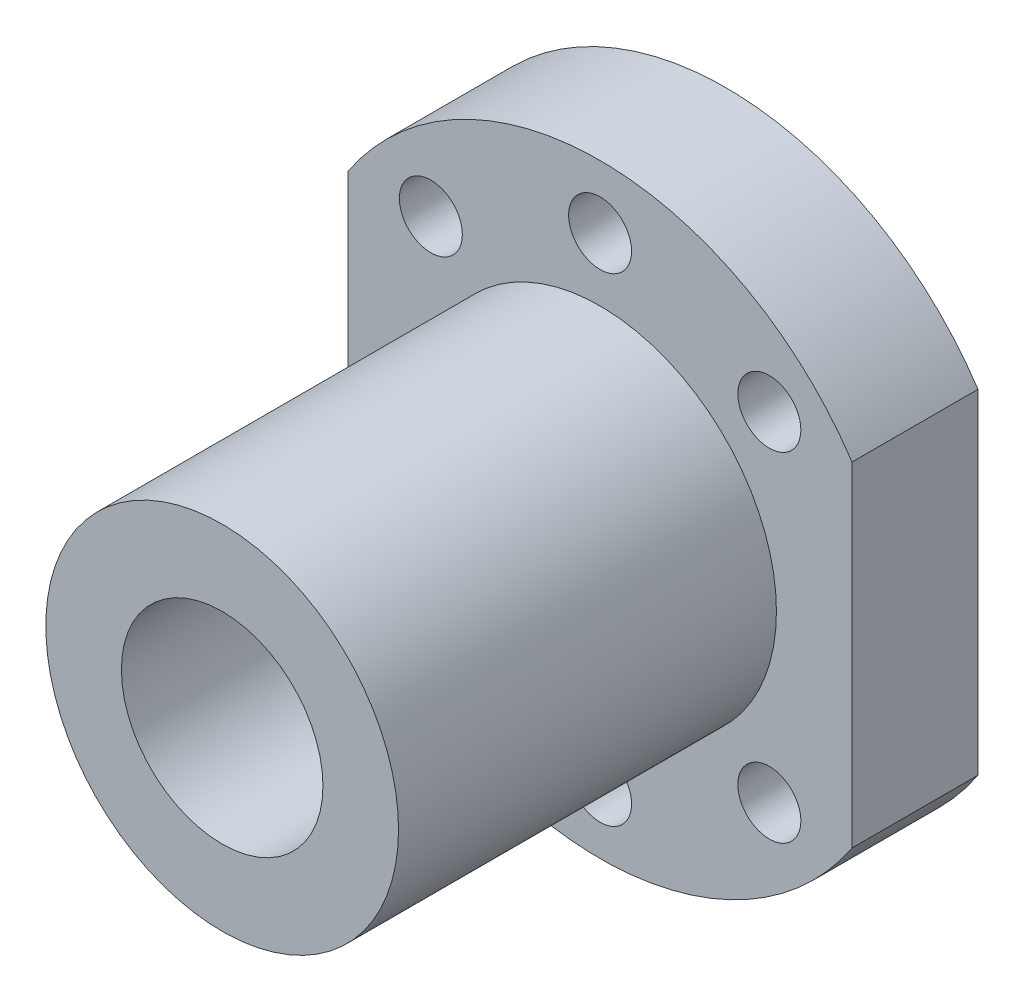
ISO-10303-21;
HEADER;
FILE_DESCRIPTION(('STEP AP214'),'2;1');
FILE_NAME('part.step','',(''),(''),'','','');
FILE_SCHEMA(('AUTOMOTIVE_DESIGN { 1 0 10303 214 1 1 1 1 }'));
ENDSEC;
DATA;
#1=APPLICATION_CONTEXT('core data for automotive mechanical design processes');
#2=APPLICATION_PROTOCOL_DEFINITION('international standard','automotive_design',2000,#1);
#3=PRODUCT_CONTEXT('',#1,'mechanical');
#4=PRODUCT('Part','Part','',(#3));
#5=PRODUCT_RELATED_PRODUCT_CATEGORY('part','',(#4));
#6=PRODUCT_DEFINITION_FORMATION('','',#4);
#7=PRODUCT_DEFINITION_CONTEXT('part definition',#1,'design');
#8=PRODUCT_DEFINITION('design','',#6,#7);
#9=PRODUCT_DEFINITION_SHAPE('','',#8);
#10=(LENGTH_UNIT() NAMED_UNIT(*) SI_UNIT(.MILLI.,.METRE.));
#11=(NAMED_UNIT(*) PLANE_ANGLE_UNIT() SI_UNIT($,.RADIAN.));
#12=(NAMED_UNIT(*) SI_UNIT($,.STERADIAN.) SOLID_ANGLE_UNIT());
#13=UNCERTAINTY_MEASURE_WITH_UNIT(LENGTH_MEASURE(1.E-05),#10,'distance_accuracy_value','');
#14=(GEOMETRIC_REPRESENTATION_CONTEXT(3) GLOBAL_UNCERTAINTY_ASSIGNED_CONTEXT((#13)) GLOBAL_UNIT_ASSIGNED_CONTEXT((#10,
#11,#12)) REPRESENTATION_CONTEXT('',''));
#15=CARTESIAN_POINT('',(0.,0.,0.));
#16=DIRECTION('',(0.,0.,1.));
#17=DIRECTION('',(1.,0.,0.));
#18=AXIS2_PLACEMENT_3D('',#15,#16,#17);
#19=CARTESIAN_POINT('',(0.,0.,10.));
#20=DIRECTION('',(0.,0.,1.));
#21=DIRECTION('',(1.,0.,0.));
#22=AXIS2_PLACEMENT_3D('',#19,#20,#21);
#23=PLANE('',#22);
#24=CARTESIAN_POINT('',(-13.4350288425443,-13.4350288425445,10.));
#25=DIRECTION('',(0.,0.,1.));
#26=DIRECTION('',(-1.,0.,0.));
#27=AXIS2_PLACEMENT_3D('',#24,#25,#26);
#28=CIRCLE('',#27,2.5);
#29=CARTESIAN_POINT('',(-15.9350288425443,-13.4350288425445,10.));
#30=VERTEX_POINT('',#29);
#31=EDGE_CURVE('E132',#30,#30,#28,.T.);
#32=ORIENTED_EDGE('',*,*,#31,.F.);
#33=EDGE_LOOP('',(#32));
#34=FACE_BOUND('',#33,.T.);
#35=CARTESIAN_POINT('',(-13.4350288425443,13.4350288425445,10.));
#36=DIRECTION('',(0.,0.,1.));
#37=DIRECTION('',(1.,0.,0.));
#38=AXIS2_PLACEMENT_3D('',#35,#36,#37);
#39=CIRCLE('',#38,2.5);
#40=CARTESIAN_POINT('',(-10.9350288425443,13.4350288425445,10.));
#41=VERTEX_POINT('',#40);
#42=EDGE_CURVE('E120',#41,#41,#39,.T.);
#43=ORIENTED_EDGE('',*,*,#42,.F.);
#44=EDGE_LOOP('',(#43));
#45=FACE_BOUND('',#44,.T.);
#46=CARTESIAN_POINT('',(0.,19.,10.));
#47=DIRECTION('',(0.,0.,1.));
#48=DIRECTION('',(1.,0.,0.));
#49=AXIS2_PLACEMENT_3D('',#46,#47,#48);
#50=CIRCLE('',#49,2.5);
#51=CARTESIAN_POINT('',(2.5,19.,10.));
#52=VERTEX_POINT('',#51);
#53=EDGE_CURVE('E99',#52,#52,#50,.T.);
#54=ORIENTED_EDGE('',*,*,#53,.F.);
#55=EDGE_LOOP('',(#54));
#56=FACE_BOUND('',#55,.T.);
#57=CARTESIAN_POINT('',(0.,0.,10.));
#58=DIRECTION('',(0.,0.,1.));
#59=DIRECTION('',(1.,0.,0.));
#60=AXIS2_PLACEMENT_3D('',#57,#58,#59);
#61=CIRCLE('',#60,24.);
#62=CARTESIAN_POINT('',(-20.,-13.2664991614216,10.));
#63=VERTEX_POINT('',#62);
#64=CARTESIAN_POINT('',(20.,-13.2664991614216,10.));
#65=VERTEX_POINT('',#64);
#66=EDGE_CURVE('E84',#63,#65,#61,.T.);
#67=ORIENTED_EDGE('',*,*,#66,.T.);
#68=DIRECTION('',(0.,1.,0.));
#69=VECTOR('',#68,1.);
#70=CARTESIAN_POINT('',(20.,13.2664991614216,10.));
#71=LINE('',#70,#69);
#72=CARTESIAN_POINT('',(20.,13.2664991614216,10.));
#73=VERTEX_POINT('',#72);
#74=EDGE_CURVE('E79',#65,#73,#71,.T.);
#75=ORIENTED_EDGE('',*,*,#74,.T.);
#76=CARTESIAN_POINT('',(0.,0.,10.));
#77=DIRECTION('',(0.,0.,1.));
#78=DIRECTION('',(1.,0.,0.));
#79=AXIS2_PLACEMENT_3D('',#76,#77,#78);
#80=CIRCLE('',#79,24.);
#81=CARTESIAN_POINT('',(-20.,13.2664991614216,10.));
#82=VERTEX_POINT('',#81);
#83=EDGE_CURVE('E82',#73,#82,#80,.T.);
#84=ORIENTED_EDGE('',*,*,#83,.T.);
#85=DIRECTION('',(0.,-1.,0.));
#86=VECTOR('',#85,1.);
#87=CARTESIAN_POINT('',(-20.,-13.2664991614216,10.));
#88=LINE('',#87,#86);
#89=EDGE_CURVE('E49',#82,#63,#88,.T.);
#90=ORIENTED_EDGE('',*,*,#89,.T.);
#91=EDGE_LOOP('',(#67,#75,#84,#90));
#92=FACE_BOUND('',#91,.T.);
#93=CARTESIAN_POINT('',(13.4350288425443,13.4350288425445,10.));
#94=DIRECTION('',(0.,0.,1.));
#95=DIRECTION('',(1.,0.,0.));
#96=AXIS2_PLACEMENT_3D('',#93,#94,#95);
#97=CIRCLE('',#96,2.5);
#98=CARTESIAN_POINT('',(15.9350288425443,13.4350288425445,10.));
#99=VERTEX_POINT('',#98);
#100=EDGE_CURVE('E114',#99,#99,#97,.T.);
#101=ORIENTED_EDGE('',*,*,#100,.F.);
#102=EDGE_LOOP('',(#101));
#103=FACE_BOUND('',#102,.T.);
#104=CARTESIAN_POINT('',(0.,-19.,10.));
#105=DIRECTION('',(0.,0.,1.));
#106=DIRECTION('',(-1.,0.,0.));
#107=AXIS2_PLACEMENT_3D('',#104,#105,#106);
#108=CIRCLE('',#107,2.5);
#109=CARTESIAN_POINT('',(-2.5,-19.,10.));
#110=VERTEX_POINT('',#109);
#111=EDGE_CURVE('E126',#110,#110,#108,.T.);
#112=ORIENTED_EDGE('',*,*,#111,.F.);
#113=EDGE_LOOP('',(#112));
#114=FACE_BOUND('',#113,.T.);
#115=CARTESIAN_POINT('',(13.4350288425443,-13.4350288425445,10.));
#116=DIRECTION('',(0.,0.,1.));
#117=DIRECTION('',(-1.,0.,0.));
#118=AXIS2_PLACEMENT_3D('',#115,#116,#117);
#119=CIRCLE('',#118,2.5);
#120=CARTESIAN_POINT('',(10.9350288425443,-13.4350288425445,10.));
#121=VERTEX_POINT('',#120);
#122=EDGE_CURVE('E138',#121,#121,#119,.T.);
#123=ORIENTED_EDGE('',*,*,#122,.F.);
#124=EDGE_LOOP('',(#123));
#125=FACE_BOUND('',#124,.T.);
#126=CARTESIAN_POINT('',(0.,0.,10.));
#127=DIRECTION('',(0.,0.,1.));
#128=DIRECTION('',(1.,0.,0.));
#129=AXIS2_PLACEMENT_3D('',#126,#127,#128);
#130=CIRCLE('',#129,14.);
#131=CARTESIAN_POINT('',(14.,0.,10.));
#132=VERTEX_POINT('',#131);
#133=EDGE_CURVE('E150',#132,#132,#130,.T.);
#134=ORIENTED_EDGE('',*,*,#133,.F.);
#135=EDGE_LOOP('',(#134));
#136=FACE_BOUND('',#135,.T.);
#137=ADVANCED_FACE('F32',(#34,#45,#56,#92,#103,#114,#125,#136),#23,.T.);
#138=CARTESIAN_POINT('',(0.,0.,0.));
#139=DIRECTION('',(0.,0.,1.));
#140=DIRECTION('',(1.,0.,0.));
#141=AXIS2_PLACEMENT_3D('',#138,#139,#140);
#142=PLANE('',#141);
#143=CARTESIAN_POINT('',(13.4350288425443,-13.4350288425445,0.));
#144=DIRECTION('',(0.,0.,1.));
#145=DIRECTION('',(-1.,0.,0.));
#146=AXIS2_PLACEMENT_3D('',#143,#144,#145);
#147=CIRCLE('',#146,2.5);
#148=CARTESIAN_POINT('',(10.9350288425443,-13.4350288425445,0.));
#149=VERTEX_POINT('',#148);
#150=EDGE_CURVE('E141',#149,#149,#147,.T.);
#151=ORIENTED_EDGE('',*,*,#150,.T.);
#152=EDGE_LOOP('',(#151));
#153=FACE_BOUND('',#152,.T.);
#154=CARTESIAN_POINT('',(0.,-19.,0.));
#155=DIRECTION('',(0.,0.,1.));
#156=DIRECTION('',(-1.,0.,0.));
#157=AXIS2_PLACEMENT_3D('',#154,#155,#156);
#158=CIRCLE('',#157,2.5);
#159=CARTESIAN_POINT('',(-2.5,-19.,0.));
#160=VERTEX_POINT('',#159);
#161=EDGE_CURVE('E129',#160,#160,#158,.T.);
#162=ORIENTED_EDGE('',*,*,#161,.T.);
#163=EDGE_LOOP('',(#162));
#164=FACE_BOUND('',#163,.T.);
#165=CARTESIAN_POINT('',(13.4350288425443,13.4350288425445,0.));
#166=DIRECTION('',(0.,0.,1.));
#167=DIRECTION('',(1.,0.,0.));
#168=AXIS2_PLACEMENT_3D('',#165,#166,#167);
#169=CIRCLE('',#168,2.5);
#170=CARTESIAN_POINT('',(15.9350288425443,13.4350288425445,0.));
#171=VERTEX_POINT('',#170);
#172=EDGE_CURVE('E117',#171,#171,#169,.T.);
#173=ORIENTED_EDGE('',*,*,#172,.T.);
#174=EDGE_LOOP('',(#173));
#175=FACE_BOUND('',#174,.T.);
#176=CARTESIAN_POINT('',(0.,0.,0.));
#177=DIRECTION('',(0.,0.,1.));
#178=DIRECTION('',(1.,0.,0.));
#179=AXIS2_PLACEMENT_3D('',#176,#177,#178);
#180=CIRCLE('',#179,24.);
#181=CARTESIAN_POINT('',(-20.,-13.2664991614216,0.));
#182=VERTEX_POINT('',#181);
#183=CARTESIAN_POINT('',(20.,-13.2664991614216,0.));
#184=VERTEX_POINT('',#183);
#185=EDGE_CURVE('E96',#182,#184,#180,.T.);
#186=ORIENTED_EDGE('',*,*,#185,.F.);
#187=DIRECTION('',(0.,-1.,0.));
#188=VECTOR('',#187,1.);
#189=CARTESIAN_POINT('',(-20.,-13.2664991614216,0.));
#190=LINE('',#189,#188);
#191=CARTESIAN_POINT('',(-20.,13.2664991614216,0.));
#192=VERTEX_POINT('',#191);
#193=EDGE_CURVE('E72',#192,#182,#190,.T.);
#194=ORIENTED_EDGE('',*,*,#193,.F.);
#195=CARTESIAN_POINT('',(0.,0.,0.));
#196=DIRECTION('',(0.,0.,1.));
#197=DIRECTION('',(1.,0.,0.));
#198=AXIS2_PLACEMENT_3D('',#195,#196,#197);
#199=CIRCLE('',#198,24.);
#200=CARTESIAN_POINT('',(20.,13.2664991614216,0.));
#201=VERTEX_POINT('',#200);
#202=EDGE_CURVE('E66',#201,#192,#199,.T.);
#203=ORIENTED_EDGE('',*,*,#202,.F.);
#204=DIRECTION('',(0.,1.,0.));
#205=VECTOR('',#204,1.);
#206=CARTESIAN_POINT('',(20.,13.2664991614216,0.));
#207=LINE('',#206,#205);
#208=EDGE_CURVE('E88',#184,#201,#207,.T.);
#209=ORIENTED_EDGE('',*,*,#208,.F.);
#210=EDGE_LOOP('',(#186,#194,#203,#209));
#211=FACE_BOUND('',#210,.T.);
#212=CARTESIAN_POINT('',(0.,19.,0.));
#213=DIRECTION('',(0.,0.,1.));
#214=DIRECTION('',(1.,0.,0.));
#215=AXIS2_PLACEMENT_3D('',#212,#213,#214);
#216=CIRCLE('',#215,2.5);
#217=CARTESIAN_POINT('',(2.5,19.,0.));
#218=VERTEX_POINT('',#217);
#219=EDGE_CURVE('E111',#218,#218,#216,.T.);
#220=ORIENTED_EDGE('',*,*,#219,.T.);
#221=EDGE_LOOP('',(#220));
#222=FACE_BOUND('',#221,.T.);
#223=CARTESIAN_POINT('',(-13.4350288425443,13.4350288425445,0.));
#224=DIRECTION('',(0.,0.,1.));
#225=DIRECTION('',(1.,0.,0.));
#226=AXIS2_PLACEMENT_3D('',#223,#224,#225);
#227=CIRCLE('',#226,2.5);
#228=CARTESIAN_POINT('',(-10.9350288425443,13.4350288425445,0.));
#229=VERTEX_POINT('',#228);
#230=EDGE_CURVE('E123',#229,#229,#227,.T.);
#231=ORIENTED_EDGE('',*,*,#230,.T.);
#232=EDGE_LOOP('',(#231));
#233=FACE_BOUND('',#232,.T.);
#234=CARTESIAN_POINT('',(-13.4350288425443,-13.4350288425445,0.));
#235=DIRECTION('',(0.,0.,1.));
#236=DIRECTION('',(-1.,0.,0.));
#237=AXIS2_PLACEMENT_3D('',#234,#235,#236);
#238=CIRCLE('',#237,2.5);
#239=CARTESIAN_POINT('',(-15.9350288425443,-13.4350288425445,0.));
#240=VERTEX_POINT('',#239);
#241=EDGE_CURVE('E135',#240,#240,#238,.T.);
#242=ORIENTED_EDGE('',*,*,#241,.T.);
#243=EDGE_LOOP('',(#242));
#244=FACE_BOUND('',#243,.T.);
#245=CARTESIAN_POINT('',(0.,0.,0.));
#246=DIRECTION('',(0.,0.,1.));
#247=DIRECTION('',(1.,0.,0.));
#248=AXIS2_PLACEMENT_3D('',#245,#246,#247);
#249=CIRCLE('',#248,8.);
#250=CARTESIAN_POINT('',(8.,0.,0.));
#251=VERTEX_POINT('',#250);
#252=EDGE_CURVE('E144',#251,#251,#249,.T.);
#253=ORIENTED_EDGE('',*,*,#252,.T.);
#254=EDGE_LOOP('',(#253));
#255=FACE_BOUND('',#254,.T.);
#256=ADVANCED_FACE('F107',(#153,#164,#175,#211,#222,#233,#244,#255),#142,.F.);
#257=CARTESIAN_POINT('',(0.,0.,10.));
#258=DIRECTION('',(0.,0.,-1.));
#259=DIRECTION('',(-1.,0.,0.));
#260=AXIS2_PLACEMENT_3D('',#257,#258,#259);
#261=CYLINDRICAL_SURFACE('',#260,24.);
#262=ORIENTED_EDGE('',*,*,#185,.T.);
#263=DIRECTION('',(0.,0.,-1.));
#264=VECTOR('',#263,1.);
#265=CARTESIAN_POINT('',(20.,-13.2664991614216,10.));
#266=LINE('',#265,#264);
#267=EDGE_CURVE('E11',#65,#184,#266,.T.);
#268=ORIENTED_EDGE('',*,*,#267,.F.);
#269=ORIENTED_EDGE('',*,*,#66,.F.);
#270=DIRECTION('',(0.,0.,-1.));
#271=VECTOR('',#270,1.);
#272=CARTESIAN_POINT('',(-20.,-13.2664991614216,10.));
#273=LINE('',#272,#271);
#274=EDGE_CURVE('E92',#63,#182,#273,.T.);
#275=ORIENTED_EDGE('',*,*,#274,.T.);
#276=EDGE_LOOP('',(#262,#268,#269,#275));
#277=FACE_BOUND('',#276,.T.);
#278=ADVANCED_FACE('F34',(#277),#261,.T.);
#279=CARTESIAN_POINT('',(20.,13.2664991614216,10.));
#280=DIRECTION('',(-1.,0.,0.));
#281=DIRECTION('',(0.,-1.,0.));
#282=AXIS2_PLACEMENT_3D('',#279,#280,#281);
#283=PLANE('',#282);
#284=ORIENTED_EDGE('',*,*,#208,.T.);
#285=DIRECTION('',(0.,0.,-1.));
#286=VECTOR('',#285,1.);
#287=CARTESIAN_POINT('',(20.,13.2664991614216,10.));
#288=LINE('',#287,#286);
#289=EDGE_CURVE('E41',#73,#201,#288,.T.);
#290=ORIENTED_EDGE('',*,*,#289,.F.);
#291=ORIENTED_EDGE('',*,*,#74,.F.);
#292=ORIENTED_EDGE('',*,*,#267,.T.);
#293=EDGE_LOOP('',(#284,#290,#291,#292));
#294=FACE_BOUND('',#293,.T.);
#295=ADVANCED_FACE('F87',(#294),#283,.F.);
#296=CARTESIAN_POINT('',(0.,0.,10.));
#297=DIRECTION('',(0.,0.,-1.));
#298=DIRECTION('',(-1.,0.,0.));
#299=AXIS2_PLACEMENT_3D('',#296,#297,#298);
#300=CYLINDRICAL_SURFACE('',#299,24.);
#301=ORIENTED_EDGE('',*,*,#202,.T.);
#302=DIRECTION('',(0.,0.,-1.));
#303=VECTOR('',#302,1.);
#304=CARTESIAN_POINT('',(-20.,13.2664991614216,10.));
#305=LINE('',#304,#303);
#306=EDGE_CURVE('E89',#82,#192,#305,.T.);
#307=ORIENTED_EDGE('',*,*,#306,.F.);
#308=ORIENTED_EDGE('',*,*,#83,.F.);
#309=ORIENTED_EDGE('',*,*,#289,.T.);
#310=EDGE_LOOP('',(#301,#307,#308,#309));
#311=FACE_BOUND('',#310,.T.);
#312=ADVANCED_FACE('F90',(#311),#300,.T.);
#313=CARTESIAN_POINT('',(-20.,-13.2664991614216,10.));
#314=DIRECTION('',(1.,0.,0.));
#315=DIRECTION('',(0.,0.,-1.));
#316=AXIS2_PLACEMENT_3D('',#313,#314,#315);
#317=PLANE('',#316);
#318=ORIENTED_EDGE('',*,*,#193,.T.);
#319=ORIENTED_EDGE('',*,*,#274,.F.);
#320=ORIENTED_EDGE('',*,*,#89,.F.);
#321=ORIENTED_EDGE('',*,*,#306,.T.);
#322=EDGE_LOOP('',(#318,#319,#320,#321));
#323=FACE_BOUND('',#322,.T.);
#324=ADVANCED_FACE('F104',(#323),#317,.F.);
#325=CARTESIAN_POINT('',(0.,19.,10.));
#326=DIRECTION('',(0.,0.,-1.));
#327=DIRECTION('',(-1.,0.,0.));
#328=AXIS2_PLACEMENT_3D('',#325,#326,#327);
#329=CYLINDRICAL_SURFACE('',#328,2.5);
#330=ORIENTED_EDGE('',*,*,#53,.T.);
#331=EDGE_LOOP('',(#330));
#332=FACE_BOUND('',#331,.T.);
#333=ORIENTED_EDGE('',*,*,#219,.F.);
#334=EDGE_LOOP('',(#333));
#335=FACE_BOUND('',#334,.T.);
#336=ADVANCED_FACE('F186',(#332,#335),#329,.F.);
#337=CARTESIAN_POINT('',(13.4350288425443,13.4350288425445,10.));
#338=DIRECTION('',(0.,0.,-1.));
#339=DIRECTION('',(-1.,0.,0.));
#340=AXIS2_PLACEMENT_3D('',#337,#338,#339);
#341=CYLINDRICAL_SURFACE('',#340,2.5);
#342=ORIENTED_EDGE('',*,*,#100,.T.);
#343=EDGE_LOOP('',(#342));
#344=FACE_BOUND('',#343,.T.);
#345=ORIENTED_EDGE('',*,*,#172,.F.);
#346=EDGE_LOOP('',(#345));
#347=FACE_BOUND('',#346,.T.);
#348=ADVANCED_FACE('F228',(#344,#347),#341,.F.);
#349=CARTESIAN_POINT('',(-13.4350288425443,13.4350288425445,10.));
#350=DIRECTION('',(0.,0.,-1.));
#351=DIRECTION('',(-1.,0.,0.));
#352=AXIS2_PLACEMENT_3D('',#349,#350,#351);
#353=CYLINDRICAL_SURFACE('',#352,2.5);
#354=ORIENTED_EDGE('',*,*,#42,.T.);
#355=EDGE_LOOP('',(#354));
#356=FACE_BOUND('',#355,.T.);
#357=ORIENTED_EDGE('',*,*,#230,.F.);
#358=EDGE_LOOP('',(#357));
#359=FACE_BOUND('',#358,.T.);
#360=ADVANCED_FACE('F236',(#356,#359),#353,.F.);
#361=CARTESIAN_POINT('',(0.,-19.,10.));
#362=DIRECTION('',(0.,0.,-1.));
#363=DIRECTION('',(-1.,0.,0.));
#364=AXIS2_PLACEMENT_3D('',#361,#362,#363);
#365=CYLINDRICAL_SURFACE('',#364,2.5);
#366=ORIENTED_EDGE('',*,*,#111,.T.);
#367=EDGE_LOOP('',(#366));
#368=FACE_BOUND('',#367,.T.);
#369=ORIENTED_EDGE('',*,*,#161,.F.);
#370=EDGE_LOOP('',(#369));
#371=FACE_BOUND('',#370,.T.);
#372=ADVANCED_FACE('F244',(#368,#371),#365,.F.);
#373=CARTESIAN_POINT('',(-13.4350288425443,-13.4350288425445,10.));
#374=DIRECTION('',(0.,0.,-1.));
#375=DIRECTION('',(-1.,0.,0.));
#376=AXIS2_PLACEMENT_3D('',#373,#374,#375);
#377=CYLINDRICAL_SURFACE('',#376,2.5);
#378=ORIENTED_EDGE('',*,*,#31,.T.);
#379=EDGE_LOOP('',(#378));
#380=FACE_BOUND('',#379,.T.);
#381=ORIENTED_EDGE('',*,*,#241,.F.);
#382=EDGE_LOOP('',(#381));
#383=FACE_BOUND('',#382,.T.);
#384=ADVANCED_FACE('F253',(#380,#383),#377,.F.);
#385=CARTESIAN_POINT('',(13.4350288425443,-13.4350288425445,10.));
#386=DIRECTION('',(0.,0.,-1.));
#387=DIRECTION('',(-1.,0.,0.));
#388=AXIS2_PLACEMENT_3D('',#385,#386,#387);
#389=CYLINDRICAL_SURFACE('',#388,2.5);
#390=ORIENTED_EDGE('',*,*,#122,.T.);
#391=EDGE_LOOP('',(#390));
#392=FACE_BOUND('',#391,.T.);
#393=ORIENTED_EDGE('',*,*,#150,.F.);
#394=EDGE_LOOP('',(#393));
#395=FACE_BOUND('',#394,.T.);
#396=ADVANCED_FACE('F172',(#392,#395),#389,.F.);
#397=CARTESIAN_POINT('',(0.,0.,10.));
#398=DIRECTION('',(0.,0.,-1.));
#399=DIRECTION('',(-1.,0.,0.));
#400=AXIS2_PLACEMENT_3D('',#397,#398,#399);
#401=CYLINDRICAL_SURFACE('',#400,8.);
#402=ORIENTED_EDGE('',*,*,#252,.F.);
#403=EDGE_LOOP('',(#402));
#404=FACE_BOUND('',#403,.T.);
#405=CARTESIAN_POINT('',(0.,0.,40.));
#406=DIRECTION('',(0.,0.,1.));
#407=DIRECTION('',(1.,0.,0.));
#408=AXIS2_PLACEMENT_3D('',#405,#406,#407);
#409=CIRCLE('',#408,8.);
#410=CARTESIAN_POINT('',(8.,0.,40.));
#411=VERTEX_POINT('',#410);
#412=EDGE_CURVE('E153',#411,#411,#409,.T.);
#413=ORIENTED_EDGE('',*,*,#412,.T.);
#414=EDGE_LOOP('',(#413));
#415=FACE_BOUND('',#414,.T.);
#416=ADVANCED_FACE('F159',(#404,#415),#401,.F.);
#417=CARTESIAN_POINT('',(0.,0.,40.));
#418=DIRECTION('',(0.,0.,1.));
#419=DIRECTION('',(1.,0.,0.));
#420=AXIS2_PLACEMENT_3D('',#417,#418,#419);
#421=PLANE('',#420);
#422=CARTESIAN_POINT('',(0.,0.,40.));
#423=DIRECTION('',(0.,0.,1.));
#424=DIRECTION('',(1.,0.,0.));
#425=AXIS2_PLACEMENT_3D('',#422,#423,#424);
#426=CIRCLE('',#425,14.);
#427=CARTESIAN_POINT('',(14.,0.,40.));
#428=VERTEX_POINT('',#427);
#429=EDGE_CURVE('E149',#428,#428,#426,.T.);
#430=ORIENTED_EDGE('',*,*,#429,.T.);
#431=EDGE_LOOP('',(#430));
#432=FACE_BOUND('',#431,.T.);
#433=ORIENTED_EDGE('',*,*,#412,.F.);
#434=EDGE_LOOP('',(#433));
#435=FACE_BOUND('',#434,.T.);
#436=ADVANCED_FACE('F161',(#432,#435),#421,.T.);
#437=CARTESIAN_POINT('',(0.,0.,40.));
#438=DIRECTION('',(0.,0.,-1.));
#439=DIRECTION('',(-1.,0.,0.));
#440=AXIS2_PLACEMENT_3D('',#437,#438,#439);
#441=CYLINDRICAL_SURFACE('',#440,14.);
#442=ORIENTED_EDGE('',*,*,#429,.F.);
#443=EDGE_LOOP('',(#442));
#444=FACE_BOUND('',#443,.T.);
#445=ORIENTED_EDGE('',*,*,#133,.T.);
#446=EDGE_LOOP('',(#445));
#447=FACE_BOUND('',#446,.T.);
#448=ADVANCED_FACE('F163',(#444,#447),#441,.T.);
#449=CLOSED_SHELL('',(#137,#256,#278,#295,#312,#324,#336,#348,#360,#372,#384,#396,#416,#436,#448));
#450=MANIFOLD_SOLID_BREP('B2',#449);
#451=ADVANCED_BREP_SHAPE_REPRESENTATION('',(#18,#450),#14);
#452=SHAPE_DEFINITION_REPRESENTATION(#9,#451);
ENDSEC;
END-ISO-10303-21;
